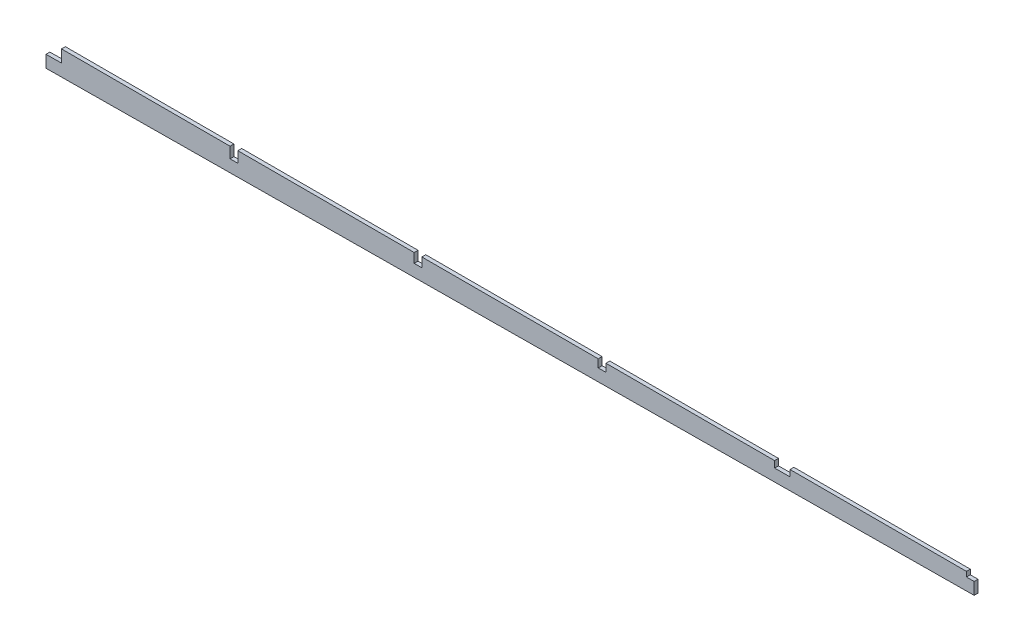
ISO-10303-21;
HEADER;
FILE_DESCRIPTION(('STEP AP214'),'2;1');
FILE_NAME('part.step','',(''),(''),'','','');
FILE_SCHEMA(('AUTOMOTIVE_DESIGN { 1 0 10303 214 1 1 1 1 }'));
ENDSEC;
DATA;
#1=APPLICATION_CONTEXT('core data for automotive mechanical design processes');
#2=APPLICATION_PROTOCOL_DEFINITION('international standard','automotive_design',2000,#1);
#3=PRODUCT_CONTEXT('',#1,'mechanical');
#4=PRODUCT('Part','Part','',(#3));
#5=PRODUCT_RELATED_PRODUCT_CATEGORY('part','',(#4));
#6=PRODUCT_DEFINITION_FORMATION('','',#4);
#7=PRODUCT_DEFINITION_CONTEXT('part definition',#1,'design');
#8=PRODUCT_DEFINITION('design','',#6,#7);
#9=PRODUCT_DEFINITION_SHAPE('','',#8);
#10=(LENGTH_UNIT() NAMED_UNIT(*) SI_UNIT(.MILLI.,.METRE.));
#11=(NAMED_UNIT(*) PLANE_ANGLE_UNIT() SI_UNIT($,.RADIAN.));
#12=(NAMED_UNIT(*) SI_UNIT($,.STERADIAN.) SOLID_ANGLE_UNIT());
#13=UNCERTAINTY_MEASURE_WITH_UNIT(LENGTH_MEASURE(1.E-05),#10,'distance_accuracy_value','');
#14=(GEOMETRIC_REPRESENTATION_CONTEXT(3) GLOBAL_UNCERTAINTY_ASSIGNED_CONTEXT((#13)) GLOBAL_UNIT_ASSIGNED_CONTEXT((#10,
#11,#12)) REPRESENTATION_CONTEXT('',''));
#15=CARTESIAN_POINT('',(0.,0.,0.));
#16=DIRECTION('',(0.,0.,1.));
#17=DIRECTION('',(1.,0.,0.));
#18=AXIS2_PLACEMENT_3D('',#15,#16,#17);
#19=CARTESIAN_POINT('',(0.,0.,1.58749999999434));
#20=DIRECTION('',(0.,0.,-1.));
#21=DIRECTION('',(-1.,0.,0.));
#22=AXIS2_PLACEMENT_3D('',#19,#20,#21);
#23=PLANE('',#22);
#24=DIRECTION('',(1.17623738695303E-12,-1.,0.));
#25=VECTOR('',#24,1.);
#26=CARTESIAN_POINT('',(292.674447160428,-10.8378511882121,1.58749999999438));
#27=LINE('',#26,#25);
#28=CARTESIAN_POINT('',(292.674447160428,-10.8378511882121,1.58749999999438));
#29=VERTEX_POINT('',#28);
#30=CARTESIAN_POINT('',(292.674447160434,-15.793203690976,1.58749999999438));
#31=VERTEX_POINT('',#30);
#32=EDGE_CURVE('E204',#29,#31,#27,.T.);
#33=ORIENTED_EDGE('',*,*,#32,.F.);
#34=DIRECTION('',(0.999966945276623,0.00813070440613762,0.));
#35=VECTOR('',#34,1.);
#36=CARTESIAN_POINT('',(289.499447160417,-10.8636670280372,1.58749999999438));
#37=LINE('',#36,#35);
#38=CARTESIAN_POINT('',(289.499447160417,-10.8636670280372,1.58749999999438));
#39=VERTEX_POINT('',#38);
#40=EDGE_CURVE('E276',#39,#29,#37,.T.);
#41=ORIENTED_EDGE('',*,*,#40,.F.);
#42=DIRECTION('',(0.,1.,0.));
#43=VECTOR('',#42,1.);
#44=CARTESIAN_POINT('',(289.499447160417,-10.8636670280372,1.58749999999438));
#45=LINE('',#44,#43);
#46=CARTESIAN_POINT('',(289.499447160417,-8.83166702803716,1.58749999999438));
#47=VERTEX_POINT('',#46);
#48=EDGE_CURVE('E273',#39,#47,#45,.T.);
#49=ORIENTED_EDGE('',*,*,#48,.T.);
#50=DIRECTION('',(-1.,0.,0.));
#51=VECTOR('',#50,1.);
#52=CARTESIAN_POINT('',(289.499447160417,-8.83166702803716,1.58749999999438));
#53=LINE('',#52,#51);
#54=CARTESIAN_POINT('',(217.109447160158,-8.83166702803716,1.58749999999437));
#55=VERTEX_POINT('',#54);
#56=EDGE_CURVE('E270',#47,#55,#53,.T.);
#57=ORIENTED_EDGE('',*,*,#56,.T.);
#58=DIRECTION('',(0.,1.,0.));
#59=VECTOR('',#58,1.);
#60=CARTESIAN_POINT('',(217.109447160158,-11.4522681760477,1.58749999999437));
#61=LINE('',#60,#59);
#62=CARTESIAN_POINT('',(217.109447160158,-11.4522681760477,1.58749999999437));
#63=VERTEX_POINT('',#62);
#64=EDGE_CURVE('E267',#63,#55,#61,.T.);
#65=ORIENTED_EDGE('',*,*,#64,.F.);
#66=DIRECTION('',(0.999966945276623,0.00813070440613562,0.));
#67=VECTOR('',#66,1.);
#68=CARTESIAN_POINT('',(210.759447160136,-11.5038998556978,1.58749999999437));
#69=LINE('',#68,#67);
#70=CARTESIAN_POINT('',(210.759447160136,-11.5038998556978,1.58749999999437));
#71=VERTEX_POINT('',#70);
#72=EDGE_CURVE('E264',#71,#63,#69,.T.);
#73=ORIENTED_EDGE('',*,*,#72,.F.);
#74=DIRECTION('',(0.,1.,0.));
#75=VECTOR('',#74,1.);
#76=CARTESIAN_POINT('',(210.759447160136,-11.5038998556978,1.58749999999437));
#77=LINE('',#76,#75);
#78=CARTESIAN_POINT('',(210.759447160136,-8.83166702803716,1.58749999999437));
#79=VERTEX_POINT('',#78);
#80=EDGE_CURVE('E261',#71,#79,#77,.T.);
#81=ORIENTED_EDGE('',*,*,#80,.T.);
#82=DIRECTION('',(-1.,0.,0.));
#83=VECTOR('',#82,1.);
#84=CARTESIAN_POINT('',(210.759447160136,-8.83166702803716,1.58749999999437));
#85=LINE('',#84,#83);
#86=CARTESIAN_POINT('',(141.544447159889,-8.83166702803716,1.58749999999436));
#87=VERTEX_POINT('',#86);
#88=EDGE_CURVE('E258',#79,#87,#85,.T.);
#89=ORIENTED_EDGE('',*,*,#88,.T.);
#90=DIRECTION('',(0.,1.,0.));
#91=VECTOR('',#90,1.);
#92=CARTESIAN_POINT('',(141.544447159889,-12.0666851638833,1.58749999999436));
#93=LINE('',#92,#91);
#94=CARTESIAN_POINT('',(141.544447159889,-12.0666851638833,1.58749999999436));
#95=VERTEX_POINT('',#94);
#96=EDGE_CURVE('E255',#95,#87,#93,.T.);
#97=ORIENTED_EDGE('',*,*,#96,.F.);
#98=DIRECTION('',(0.999966945276623,0.00813070440613791,0.));
#99=VECTOR('',#98,1.);
#100=CARTESIAN_POINT('',(138.369447159877,-12.0925010037083,1.58749999999436));
#101=LINE('',#100,#99);
#102=CARTESIAN_POINT('',(138.369447159877,-12.0925010037083,1.58749999999436));
#103=VERTEX_POINT('',#102);
#104=EDGE_CURVE('E252',#103,#95,#101,.T.);
#105=ORIENTED_EDGE('',*,*,#104,.F.);
#106=DIRECTION('',(0.,1.,0.));
#107=VECTOR('',#106,1.);
#108=CARTESIAN_POINT('',(138.369447159877,-12.0925010037083,1.58749999999436));
#109=LINE('',#108,#107);
#110=CARTESIAN_POINT('',(138.369447159877,-8.83166702803716,1.58749999999436));
#111=VERTEX_POINT('',#110);
#112=EDGE_CURVE('E249',#103,#111,#109,.T.);
#113=ORIENTED_EDGE('',*,*,#112,.T.);
#114=DIRECTION('',(-1.,0.,0.));
#115=VECTOR('',#114,1.);
#116=CARTESIAN_POINT('',(138.369447159877,-8.83166702803716,1.58749999999436));
#117=LINE('',#116,#115);
#118=CARTESIAN_POINT('',(65.9794471596188,-8.83166702803716,1.58749999999435));
#119=VERTEX_POINT('',#118);
#120=EDGE_CURVE('E246',#111,#119,#117,.T.);
#121=ORIENTED_EDGE('',*,*,#120,.T.);
#122=DIRECTION('',(0.,1.,0.));
#123=VECTOR('',#122,1.);
#124=CARTESIAN_POINT('',(65.9794471596188,-12.6811021517189,1.58749999999435));
#125=LINE('',#124,#123);
#126=CARTESIAN_POINT('',(65.9794471596188,-12.6811021517189,1.58749999999435));
#127=VERTEX_POINT('',#126);
#128=EDGE_CURVE('E243',#127,#119,#125,.T.);
#129=ORIENTED_EDGE('',*,*,#128,.F.);
#130=DIRECTION('',(0.999966945276623,0.00813070440613784,0.));
#131=VECTOR('',#130,1.);
#132=CARTESIAN_POINT('',(62.8044471596074,-12.7069179915439,1.58749999999435));
#133=LINE('',#132,#131);
#134=CARTESIAN_POINT('',(62.8044471596074,-12.7069179915439,1.58749999999435));
#135=VERTEX_POINT('',#134);
#136=EDGE_CURVE('E240',#135,#127,#133,.T.);
#137=ORIENTED_EDGE('',*,*,#136,.F.);
#138=DIRECTION('',(0.,1.,0.));
#139=VECTOR('',#138,1.);
#140=CARTESIAN_POINT('',(62.8044471596074,-12.7069179915439,1.58749999999435));
#141=LINE('',#140,#139);
#142=CARTESIAN_POINT('',(62.8044471596074,-8.83166702803716,1.58749999999435));
#143=VERTEX_POINT('',#142);
#144=EDGE_CURVE('E237',#135,#143,#141,.T.);
#145=ORIENTED_EDGE('',*,*,#144,.T.);
#146=DIRECTION('',(-1.,0.,0.));
#147=VECTOR('',#146,1.);
#148=CARTESIAN_POINT('',(62.8044471596074,-8.83166702803716,1.58749999999435));
#149=LINE('',#148,#147);
#150=CARTESIAN_POINT('',(-9.58555284065082,-8.83166702803716,1.58749999999434));
#151=VERTEX_POINT('',#150);
#152=EDGE_CURVE('E234',#143,#151,#149,.T.);
#153=ORIENTED_EDGE('',*,*,#152,.T.);
#154=DIRECTION('',(0.,1.,0.));
#155=VECTOR('',#154,1.);
#156=CARTESIAN_POINT('',(-9.58555284065082,-13.2955191395544,1.58749999999434));
#157=LINE('',#156,#155);
#158=CARTESIAN_POINT('',(-9.58555284065082,-13.2955191395544,1.58749999999434));
#159=VERTEX_POINT('',#158);
#160=EDGE_CURVE('E231',#159,#151,#157,.T.);
#161=ORIENTED_EDGE('',*,*,#160,.F.);
#162=DIRECTION('',(0.999966945276622,0.00813070440613889,0.));
#163=VECTOR('',#162,1.);
#164=CARTESIAN_POINT('',(-12.7605528406622,-13.3213349793795,1.58749999999434));
#165=LINE('',#164,#163);
#166=CARTESIAN_POINT('',(-12.7605528406622,-13.3213349793795,1.58749999999434));
#167=VERTEX_POINT('',#166);
#168=EDGE_CURVE('E228',#167,#159,#165,.T.);
#169=ORIENTED_EDGE('',*,*,#168,.F.);
#170=DIRECTION('',(0.,1.,0.));
#171=VECTOR('',#170,1.);
#172=CARTESIAN_POINT('',(-12.7605528406622,-13.3213349793795,1.58749999999434));
#173=LINE('',#172,#171);
#174=CARTESIAN_POINT('',(-12.7605528406622,-8.83166702803716,1.58749999999434));
#175=VERTEX_POINT('',#174);
#176=EDGE_CURVE('E225',#167,#175,#173,.T.);
#177=ORIENTED_EDGE('',*,*,#176,.T.);
#178=DIRECTION('',(-1.,0.,0.));
#179=VECTOR('',#178,1.);
#180=CARTESIAN_POINT('',(-12.7605528406622,-8.83166702803716,1.58749999999434));
#181=LINE('',#180,#179);
#182=CARTESIAN_POINT('',(-81.9755528409093,-8.83166702803716,1.58749999999433));
#183=VERTEX_POINT('',#182);
#184=EDGE_CURVE('E222',#175,#183,#181,.T.);
#185=ORIENTED_EDGE('',*,*,#184,.T.);
#186=DIRECTION('',(0.,1.,0.));
#187=VECTOR('',#186,1.);
#188=CARTESIAN_POINT('',(-81.9755528409093,-13.884120287565,1.58749999999433));
#189=LINE('',#188,#187);
#190=CARTESIAN_POINT('',(-81.9755528409093,-13.884120287565,1.58749999999433));
#191=VERTEX_POINT('',#190);
#192=EDGE_CURVE('E219',#191,#183,#189,.T.);
#193=ORIENTED_EDGE('',*,*,#192,.F.);
#194=DIRECTION('',(0.999966945276623,0.00813070440613791,0.));
#195=VECTOR('',#194,1.);
#196=CARTESIAN_POINT('',(-88.3255528409319,-13.935751967215,1.58749999999433));
#197=LINE('',#196,#195);
#198=CARTESIAN_POINT('',(-88.3255528409319,-13.935751967215,1.58749999999433));
#199=VERTEX_POINT('',#198);
#200=EDGE_CURVE('E216',#199,#191,#197,.T.);
#201=ORIENTED_EDGE('',*,*,#200,.F.);
#202=DIRECTION('',(0.,1.,0.));
#203=VECTOR('',#202,1.);
#204=CARTESIAN_POINT('',(-88.3255528409319,-18.9085485464381,1.58749999999433));
#205=LINE('',#204,#203);
#206=CARTESIAN_POINT('',(-88.3255528409319,-18.9085485464381,1.58749999999433));
#207=VERTEX_POINT('',#206);
#208=EDGE_CURVE('E207',#207,#199,#205,.T.);
#209=ORIENTED_EDGE('',*,*,#208,.F.);
#210=DIRECTION('',(-0.999966571989294,-0.00817648481803085,0.));
#211=VECTOR('',#210,1.);
#212=CARTESIAN_POINT('',(292.674447160434,-15.793203690976,1.58749999999438));
#213=LINE('',#212,#211);
#214=EDGE_CURVE('E196',#31,#207,#213,.T.);
#215=ORIENTED_EDGE('',*,*,#214,.F.);
#216=EDGE_LOOP('',(#33,#41,#49,#57,#65,#73,#81,#89,#97,#105,#113,#121,#129,#137,#145,#153,#161,
#169,#177,#185,#193,#201,#209,#215));
#217=FACE_BOUND('',#216,.T.);
#218=ADVANCED_FACE('F32',(#217),#23,.F.);
#219=CARTESIAN_POINT('',(289.499447160417,-10.8636670280372,-381.133235945354));
#220=DIRECTION('',(0.00813070440613762,-0.999966945276623,0.));
#221=DIRECTION('',(0.999966945276623,0.00813070440613763,0.));
#222=AXIS2_PLACEMENT_3D('',#219,#220,#221);
#223=PLANE('',#222);
#224=DIRECTION('',(0.,0.,1.));
#225=VECTOR('',#224,1.);
#226=CARTESIAN_POINT('',(292.674447160428,-10.8378511882121,-381.133235945354));
#227=LINE('',#226,#225);
#228=CARTESIAN_POINT('',(292.674447160428,-10.8378511882121,0.));
#229=VERTEX_POINT('',#228);
#230=EDGE_CURVE('E210',#229,#29,#227,.T.);
#231=ORIENTED_EDGE('',*,*,#230,.F.);
#232=DIRECTION('',(-0.999966945276623,-0.00813070440613763,0.));
#233=VECTOR('',#232,1.);
#234=CARTESIAN_POINT('',(289.499447160417,-10.8636670280372,0.));
#235=LINE('',#234,#233);
#236=CARTESIAN_POINT('',(289.499447160417,-10.8636670280372,0.));
#237=VERTEX_POINT('',#236);
#238=EDGE_CURVE('E36',#229,#237,#235,.T.);
#239=ORIENTED_EDGE('',*,*,#238,.T.);
#240=DIRECTION('',(0.,0.,1.));
#241=VECTOR('',#240,1.);
#242=CARTESIAN_POINT('',(289.499447160417,-10.8636670280372,-381.133235945354));
#243=LINE('',#242,#241);
#244=EDGE_CURVE('E279',#237,#39,#243,.T.);
#245=ORIENTED_EDGE('',*,*,#244,.T.);
#246=ORIENTED_EDGE('',*,*,#40,.T.);
#247=EDGE_LOOP('',(#231,#239,#245,#246));
#248=FACE_BOUND('',#247,.T.);
#249=ADVANCED_FACE('F378',(#248),#223,.F.);
#250=CARTESIAN_POINT('',(289.499447160417,-10.8636670280372,-381.133235945354));
#251=DIRECTION('',(1.,0.,0.));
#252=DIRECTION('',(0.,0.,-1.));
#253=AXIS2_PLACEMENT_3D('',#250,#251,#252);
#254=PLANE('',#253);
#255=DIRECTION('',(0.,-1.,0.));
#256=VECTOR('',#255,1.);
#257=CARTESIAN_POINT('',(289.499447160417,-10.8636670280372,0.));
#258=LINE('',#257,#256);
#259=CARTESIAN_POINT('',(289.499447160417,-8.83166702803716,0.));
#260=VERTEX_POINT('',#259);
#261=EDGE_CURVE('E373',#260,#237,#258,.T.);
#262=ORIENTED_EDGE('',*,*,#261,.F.);
#263=DIRECTION('',(0.,0.,1.));
#264=VECTOR('',#263,1.);
#265=CARTESIAN_POINT('',(289.499447160417,-8.83166702803716,-381.133235945354));
#266=LINE('',#265,#264);
#267=EDGE_CURVE('E281',#260,#47,#266,.T.);
#268=ORIENTED_EDGE('',*,*,#267,.T.);
#269=ORIENTED_EDGE('',*,*,#48,.F.);
#270=ORIENTED_EDGE('',*,*,#244,.F.);
#271=EDGE_LOOP('',(#262,#268,#269,#270));
#272=FACE_BOUND('',#271,.T.);
#273=ADVANCED_FACE('F390',(#272),#254,.T.);
#274=CARTESIAN_POINT('',(289.499447160417,-8.83166702803716,-381.133235945354));
#275=DIRECTION('',(0.,1.,0.));
#276=DIRECTION('',(0.,0.,1.));
#277=AXIS2_PLACEMENT_3D('',#274,#275,#276);
#278=PLANE('',#277);
#279=DIRECTION('',(1.,0.,0.));
#280=VECTOR('',#279,1.);
#281=CARTESIAN_POINT('',(289.499447160417,-8.83166702803716,0.));
#282=LINE('',#281,#280);
#283=CARTESIAN_POINT('',(217.109447160158,-8.83166702803716,0.));
#284=VERTEX_POINT('',#283);
#285=EDGE_CURVE('E371',#284,#260,#282,.T.);
#286=ORIENTED_EDGE('',*,*,#285,.F.);
#287=DIRECTION('',(0.,0.,1.));
#288=VECTOR('',#287,1.);
#289=CARTESIAN_POINT('',(217.109447160158,-8.83166702803716,-381.133235945354));
#290=LINE('',#289,#288);
#291=EDGE_CURVE('E283',#284,#55,#290,.T.);
#292=ORIENTED_EDGE('',*,*,#291,.T.);
#293=ORIENTED_EDGE('',*,*,#56,.F.);
#294=ORIENTED_EDGE('',*,*,#267,.F.);
#295=EDGE_LOOP('',(#286,#292,#293,#294));
#296=FACE_BOUND('',#295,.T.);
#297=ADVANCED_FACE('F395',(#296),#278,.T.);
#298=CARTESIAN_POINT('',(217.109447160158,-11.4522681760477,-381.133235945354));
#299=DIRECTION('',(1.,0.,0.));
#300=DIRECTION('',(0.,0.,-1.));
#301=AXIS2_PLACEMENT_3D('',#298,#299,#300);
#302=PLANE('',#301);
#303=ORIENTED_EDGE('',*,*,#291,.F.);
#304=DIRECTION('',(0.,-1.,0.));
#305=VECTOR('',#304,1.);
#306=CARTESIAN_POINT('',(217.109447160158,-11.4522681760477,0.));
#307=LINE('',#306,#305);
#308=CARTESIAN_POINT('',(217.109447160158,-11.4522681760477,0.));
#309=VERTEX_POINT('',#308);
#310=EDGE_CURVE('E368',#284,#309,#307,.T.);
#311=ORIENTED_EDGE('',*,*,#310,.T.);
#312=DIRECTION('',(0.,0.,1.));
#313=VECTOR('',#312,1.);
#314=CARTESIAN_POINT('',(217.109447160158,-11.4522681760477,-381.133235945354));
#315=LINE('',#314,#313);
#316=EDGE_CURVE('E285',#309,#63,#315,.T.);
#317=ORIENTED_EDGE('',*,*,#316,.T.);
#318=ORIENTED_EDGE('',*,*,#64,.T.);
#319=EDGE_LOOP('',(#303,#311,#317,#318));
#320=FACE_BOUND('',#319,.T.);
#321=ADVANCED_FACE('F399',(#320),#302,.F.);
#322=CARTESIAN_POINT('',(210.759447160136,-11.5038998556978,-381.133235945354));
#323=DIRECTION('',(0.00813070440613562,-0.999966945276623,0.));
#324=DIRECTION('',(0.999966945276623,0.00813070440613562,0.));
#325=AXIS2_PLACEMENT_3D('',#322,#323,#324);
#326=PLANE('',#325);
#327=ORIENTED_EDGE('',*,*,#316,.F.);
#328=DIRECTION('',(-0.999966945276623,-0.00813070440613562,0.));
#329=VECTOR('',#328,1.);
#330=CARTESIAN_POINT('',(210.759447160136,-11.5038998556978,0.));
#331=LINE('',#330,#329);
#332=CARTESIAN_POINT('',(210.759447160136,-11.5038998556978,0.));
#333=VERTEX_POINT('',#332);
#334=EDGE_CURVE('E365',#309,#333,#331,.T.);
#335=ORIENTED_EDGE('',*,*,#334,.T.);
#336=DIRECTION('',(0.,0.,1.));
#337=VECTOR('',#336,1.);
#338=CARTESIAN_POINT('',(210.759447160136,-11.5038998556978,-381.133235945354));
#339=LINE('',#338,#337);
#340=EDGE_CURVE('E287',#333,#71,#339,.T.);
#341=ORIENTED_EDGE('',*,*,#340,.T.);
#342=ORIENTED_EDGE('',*,*,#72,.T.);
#343=EDGE_LOOP('',(#327,#335,#341,#342));
#344=FACE_BOUND('',#343,.T.);
#345=ADVANCED_FACE('F403',(#344),#326,.F.);
#346=CARTESIAN_POINT('',(210.759447160136,-11.5038998556978,-381.133235945354));
#347=DIRECTION('',(1.,0.,0.));
#348=DIRECTION('',(0.,0.,-1.));
#349=AXIS2_PLACEMENT_3D('',#346,#347,#348);
#350=PLANE('',#349);
#351=DIRECTION('',(0.,-1.,0.));
#352=VECTOR('',#351,1.);
#353=CARTESIAN_POINT('',(210.759447160136,-11.5038998556978,0.));
#354=LINE('',#353,#352);
#355=CARTESIAN_POINT('',(210.759447160136,-8.83166702803716,0.));
#356=VERTEX_POINT('',#355);
#357=EDGE_CURVE('E363',#356,#333,#354,.T.);
#358=ORIENTED_EDGE('',*,*,#357,.F.);
#359=DIRECTION('',(0.,0.,1.));
#360=VECTOR('',#359,1.);
#361=CARTESIAN_POINT('',(210.759447160136,-8.83166702803716,-381.133235945354));
#362=LINE('',#361,#360);
#363=EDGE_CURVE('E289',#356,#79,#362,.T.);
#364=ORIENTED_EDGE('',*,*,#363,.T.);
#365=ORIENTED_EDGE('',*,*,#80,.F.);
#366=ORIENTED_EDGE('',*,*,#340,.F.);
#367=EDGE_LOOP('',(#358,#364,#365,#366));
#368=FACE_BOUND('',#367,.T.);
#369=ADVANCED_FACE('F407',(#368),#350,.T.);
#370=CARTESIAN_POINT('',(210.759447160136,-8.83166702803716,-381.133235945354));
#371=DIRECTION('',(0.,1.,0.));
#372=DIRECTION('',(0.,0.,1.));
#373=AXIS2_PLACEMENT_3D('',#370,#371,#372);
#374=PLANE('',#373);
#375=DIRECTION('',(1.,0.,0.));
#376=VECTOR('',#375,1.);
#377=CARTESIAN_POINT('',(210.759447160136,-8.83166702803716,0.));
#378=LINE('',#377,#376);
#379=CARTESIAN_POINT('',(141.544447159889,-8.83166702803716,0.));
#380=VERTEX_POINT('',#379);
#381=EDGE_CURVE('E361',#380,#356,#378,.T.);
#382=ORIENTED_EDGE('',*,*,#381,.F.);
#383=DIRECTION('',(0.,0.,1.));
#384=VECTOR('',#383,1.);
#385=CARTESIAN_POINT('',(141.544447159889,-8.83166702803716,-381.133235945354));
#386=LINE('',#385,#384);
#387=EDGE_CURVE('E291',#380,#87,#386,.T.);
#388=ORIENTED_EDGE('',*,*,#387,.T.);
#389=ORIENTED_EDGE('',*,*,#88,.F.);
#390=ORIENTED_EDGE('',*,*,#363,.F.);
#391=EDGE_LOOP('',(#382,#388,#389,#390));
#392=FACE_BOUND('',#391,.T.);
#393=ADVANCED_FACE('F411',(#392),#374,.T.);
#394=CARTESIAN_POINT('',(141.544447159889,-12.0666851638833,-381.133235945354));
#395=DIRECTION('',(1.,0.,0.));
#396=DIRECTION('',(0.,0.,-1.));
#397=AXIS2_PLACEMENT_3D('',#394,#395,#396);
#398=PLANE('',#397);
#399=ORIENTED_EDGE('',*,*,#387,.F.);
#400=DIRECTION('',(0.,-1.,0.));
#401=VECTOR('',#400,1.);
#402=CARTESIAN_POINT('',(141.544447159889,-12.0666851638833,0.));
#403=LINE('',#402,#401);
#404=CARTESIAN_POINT('',(141.544447159889,-12.0666851638833,0.));
#405=VERTEX_POINT('',#404);
#406=EDGE_CURVE('E358',#380,#405,#403,.T.);
#407=ORIENTED_EDGE('',*,*,#406,.T.);
#408=DIRECTION('',(0.,0.,1.));
#409=VECTOR('',#408,1.);
#410=CARTESIAN_POINT('',(141.544447159889,-12.0666851638833,-381.133235945354));
#411=LINE('',#410,#409);
#412=EDGE_CURVE('E293',#405,#95,#411,.T.);
#413=ORIENTED_EDGE('',*,*,#412,.T.);
#414=ORIENTED_EDGE('',*,*,#96,.T.);
#415=EDGE_LOOP('',(#399,#407,#413,#414));
#416=FACE_BOUND('',#415,.T.);
#417=ADVANCED_FACE('F415',(#416),#398,.F.);
#418=CARTESIAN_POINT('',(138.369447159877,-12.0925010037083,-381.133235945354));
#419=DIRECTION('',(0.00813070440613791,-0.999966945276623,0.));
#420=DIRECTION('',(0.999966945276623,0.00813070440613791,0.));
#421=AXIS2_PLACEMENT_3D('',#418,#419,#420);
#422=PLANE('',#421);
#423=ORIENTED_EDGE('',*,*,#412,.F.);
#424=DIRECTION('',(-0.999966945276623,-0.00813070440613791,0.));
#425=VECTOR('',#424,1.);
#426=CARTESIAN_POINT('',(138.369447159877,-12.0925010037083,0.));
#427=LINE('',#426,#425);
#428=CARTESIAN_POINT('',(138.369447159877,-12.0925010037083,0.));
#429=VERTEX_POINT('',#428);
#430=EDGE_CURVE('E355',#405,#429,#427,.T.);
#431=ORIENTED_EDGE('',*,*,#430,.T.);
#432=DIRECTION('',(0.,0.,1.));
#433=VECTOR('',#432,1.);
#434=CARTESIAN_POINT('',(138.369447159877,-12.0925010037083,-381.133235945354));
#435=LINE('',#434,#433);
#436=EDGE_CURVE('E295',#429,#103,#435,.T.);
#437=ORIENTED_EDGE('',*,*,#436,.T.);
#438=ORIENTED_EDGE('',*,*,#104,.T.);
#439=EDGE_LOOP('',(#423,#431,#437,#438));
#440=FACE_BOUND('',#439,.T.);
#441=ADVANCED_FACE('F419',(#440),#422,.F.);
#442=CARTESIAN_POINT('',(138.369447159877,-12.0925010037083,-381.133235945354));
#443=DIRECTION('',(1.,0.,0.));
#444=DIRECTION('',(0.,0.,-1.));
#445=AXIS2_PLACEMENT_3D('',#442,#443,#444);
#446=PLANE('',#445);
#447=DIRECTION('',(0.,-1.,0.));
#448=VECTOR('',#447,1.);
#449=CARTESIAN_POINT('',(138.369447159877,-12.0925010037083,0.));
#450=LINE('',#449,#448);
#451=CARTESIAN_POINT('',(138.369447159877,-8.83166702803716,0.));
#452=VERTEX_POINT('',#451);
#453=EDGE_CURVE('E353',#452,#429,#450,.T.);
#454=ORIENTED_EDGE('',*,*,#453,.F.);
#455=DIRECTION('',(0.,0.,1.));
#456=VECTOR('',#455,1.);
#457=CARTESIAN_POINT('',(138.369447159877,-8.83166702803716,-381.133235945354));
#458=LINE('',#457,#456);
#459=EDGE_CURVE('E297',#452,#111,#458,.T.);
#460=ORIENTED_EDGE('',*,*,#459,.T.);
#461=ORIENTED_EDGE('',*,*,#112,.F.);
#462=ORIENTED_EDGE('',*,*,#436,.F.);
#463=EDGE_LOOP('',(#454,#460,#461,#462));
#464=FACE_BOUND('',#463,.T.);
#465=ADVANCED_FACE('F423',(#464),#446,.T.);
#466=CARTESIAN_POINT('',(138.369447159877,-8.83166702803716,-381.133235945354));
#467=DIRECTION('',(0.,1.,0.));
#468=DIRECTION('',(0.,0.,1.));
#469=AXIS2_PLACEMENT_3D('',#466,#467,#468);
#470=PLANE('',#469);
#471=DIRECTION('',(1.,0.,0.));
#472=VECTOR('',#471,1.);
#473=CARTESIAN_POINT('',(138.369447159877,-8.83166702803716,0.));
#474=LINE('',#473,#472);
#475=CARTESIAN_POINT('',(65.9794471596188,-8.83166702803716,0.));
#476=VERTEX_POINT('',#475);
#477=EDGE_CURVE('E351',#476,#452,#474,.T.);
#478=ORIENTED_EDGE('',*,*,#477,.F.);
#479=DIRECTION('',(0.,0.,1.));
#480=VECTOR('',#479,1.);
#481=CARTESIAN_POINT('',(65.9794471596188,-8.83166702803716,-381.133235945354));
#482=LINE('',#481,#480);
#483=EDGE_CURVE('E299',#476,#119,#482,.T.);
#484=ORIENTED_EDGE('',*,*,#483,.T.);
#485=ORIENTED_EDGE('',*,*,#120,.F.);
#486=ORIENTED_EDGE('',*,*,#459,.F.);
#487=EDGE_LOOP('',(#478,#484,#485,#486));
#488=FACE_BOUND('',#487,.T.);
#489=ADVANCED_FACE('F427',(#488),#470,.T.);
#490=CARTESIAN_POINT('',(65.9794471596188,-12.6811021517189,-381.133235945354));
#491=DIRECTION('',(1.,0.,0.));
#492=DIRECTION('',(0.,0.,-1.));
#493=AXIS2_PLACEMENT_3D('',#490,#491,#492);
#494=PLANE('',#493);
#495=ORIENTED_EDGE('',*,*,#483,.F.);
#496=DIRECTION('',(0.,-1.,0.));
#497=VECTOR('',#496,1.);
#498=CARTESIAN_POINT('',(65.9794471596188,-12.6811021517189,0.));
#499=LINE('',#498,#497);
#500=CARTESIAN_POINT('',(65.9794471596188,-12.6811021517189,0.));
#501=VERTEX_POINT('',#500);
#502=EDGE_CURVE('E348',#476,#501,#499,.T.);
#503=ORIENTED_EDGE('',*,*,#502,.T.);
#504=DIRECTION('',(0.,0.,1.));
#505=VECTOR('',#504,1.);
#506=CARTESIAN_POINT('',(65.9794471596188,-12.6811021517189,-381.133235945354));
#507=LINE('',#506,#505);
#508=EDGE_CURVE('E301',#501,#127,#507,.T.);
#509=ORIENTED_EDGE('',*,*,#508,.T.);
#510=ORIENTED_EDGE('',*,*,#128,.T.);
#511=EDGE_LOOP('',(#495,#503,#509,#510));
#512=FACE_BOUND('',#511,.T.);
#513=ADVANCED_FACE('F431',(#512),#494,.F.);
#514=CARTESIAN_POINT('',(62.8044471596075,-12.7069179915439,-381.133235945354));
#515=DIRECTION('',(0.00813070440613784,-0.999966945276623,0.));
#516=DIRECTION('',(0.999966945276623,0.00813070440613784,0.));
#517=AXIS2_PLACEMENT_3D('',#514,#515,#516);
#518=PLANE('',#517);
#519=ORIENTED_EDGE('',*,*,#508,.F.);
#520=DIRECTION('',(-0.999966945276623,-0.00813070440613784,0.));
#521=VECTOR('',#520,1.);
#522=CARTESIAN_POINT('',(62.8044471596075,-12.7069179915439,0.));
#523=LINE('',#522,#521);
#524=CARTESIAN_POINT('',(62.8044471596074,-12.7069179915439,0.));
#525=VERTEX_POINT('',#524);
#526=EDGE_CURVE('E345',#501,#525,#523,.T.);
#527=ORIENTED_EDGE('',*,*,#526,.T.);
#528=DIRECTION('',(0.,0.,1.));
#529=VECTOR('',#528,1.);
#530=CARTESIAN_POINT('',(62.8044471596075,-12.7069179915439,-381.133235945354));
#531=LINE('',#530,#529);
#532=EDGE_CURVE('E303',#525,#135,#531,.T.);
#533=ORIENTED_EDGE('',*,*,#532,.T.);
#534=ORIENTED_EDGE('',*,*,#136,.T.);
#535=EDGE_LOOP('',(#519,#527,#533,#534));
#536=FACE_BOUND('',#535,.T.);
#537=ADVANCED_FACE('F435',(#536),#518,.F.);
#538=CARTESIAN_POINT('',(62.8044471596075,-12.7069179915439,-381.133235945354));
#539=DIRECTION('',(1.,0.,0.));
#540=DIRECTION('',(0.,0.,-1.));
#541=AXIS2_PLACEMENT_3D('',#538,#539,#540);
#542=PLANE('',#541);
#543=DIRECTION('',(0.,-1.,0.));
#544=VECTOR('',#543,1.);
#545=CARTESIAN_POINT('',(62.8044471596074,-12.7069179915439,0.));
#546=LINE('',#545,#544);
#547=CARTESIAN_POINT('',(62.8044471596074,-8.83166702803716,0.));
#548=VERTEX_POINT('',#547);
#549=EDGE_CURVE('E343',#548,#525,#546,.T.);
#550=ORIENTED_EDGE('',*,*,#549,.F.);
#551=DIRECTION('',(0.,0.,1.));
#552=VECTOR('',#551,1.);
#553=CARTESIAN_POINT('',(62.8044471596075,-8.83166702803716,-381.133235945354));
#554=LINE('',#553,#552);
#555=EDGE_CURVE('E305',#548,#143,#554,.T.);
#556=ORIENTED_EDGE('',*,*,#555,.T.);
#557=ORIENTED_EDGE('',*,*,#144,.F.);
#558=ORIENTED_EDGE('',*,*,#532,.F.);
#559=EDGE_LOOP('',(#550,#556,#557,#558));
#560=FACE_BOUND('',#559,.T.);
#561=ADVANCED_FACE('F439',(#560),#542,.T.);
#562=CARTESIAN_POINT('',(62.8044471596075,-8.83166702803716,-381.133235945354));
#563=DIRECTION('',(0.,1.,0.));
#564=DIRECTION('',(0.,0.,1.));
#565=AXIS2_PLACEMENT_3D('',#562,#563,#564);
#566=PLANE('',#565);
#567=DIRECTION('',(1.,0.,0.));
#568=VECTOR('',#567,1.);
#569=CARTESIAN_POINT('',(62.8044471596075,-8.83166702803716,0.));
#570=LINE('',#569,#568);
#571=CARTESIAN_POINT('',(-9.58555284065082,-8.83166702803716,0.));
#572=VERTEX_POINT('',#571);
#573=EDGE_CURVE('E341',#572,#548,#570,.T.);
#574=ORIENTED_EDGE('',*,*,#573,.F.);
#575=DIRECTION('',(0.,0.,1.));
#576=VECTOR('',#575,1.);
#577=CARTESIAN_POINT('',(-9.58555284065076,-8.83166702803716,-381.133235945354));
#578=LINE('',#577,#576);
#579=EDGE_CURVE('E307',#572,#151,#578,.T.);
#580=ORIENTED_EDGE('',*,*,#579,.T.);
#581=ORIENTED_EDGE('',*,*,#152,.F.);
#582=ORIENTED_EDGE('',*,*,#555,.F.);
#583=EDGE_LOOP('',(#574,#580,#581,#582));
#584=FACE_BOUND('',#583,.T.);
#585=ADVANCED_FACE('F443',(#584),#566,.T.);
#586=CARTESIAN_POINT('',(-9.58555284065076,-13.2955191395544,-381.133235945354));
#587=DIRECTION('',(1.,0.,0.));
#588=DIRECTION('',(0.,1.,0.));
#589=AXIS2_PLACEMENT_3D('',#586,#587,#588);
#590=PLANE('',#589);
#591=ORIENTED_EDGE('',*,*,#579,.F.);
#592=DIRECTION('',(0.,-1.,0.));
#593=VECTOR('',#592,1.);
#594=CARTESIAN_POINT('',(-9.58555284065082,-13.2955191395544,0.));
#595=LINE('',#594,#593);
#596=CARTESIAN_POINT('',(-9.58555284065082,-13.2955191395544,0.));
#597=VERTEX_POINT('',#596);
#598=EDGE_CURVE('E338',#572,#597,#595,.T.);
#599=ORIENTED_EDGE('',*,*,#598,.T.);
#600=DIRECTION('',(0.,0.,1.));
#601=VECTOR('',#600,1.);
#602=CARTESIAN_POINT('',(-9.58555284065076,-13.2955191395544,-381.133235945354));
#603=LINE('',#602,#601);
#604=EDGE_CURVE('E309',#597,#159,#603,.T.);
#605=ORIENTED_EDGE('',*,*,#604,.T.);
#606=ORIENTED_EDGE('',*,*,#160,.T.);
#607=EDGE_LOOP('',(#591,#599,#605,#606));
#608=FACE_BOUND('',#607,.T.);
#609=ADVANCED_FACE('F447',(#608),#590,.F.);
#610=CARTESIAN_POINT('',(-12.7605528406621,-13.3213349793795,-381.133235945354));
#611=DIRECTION('',(0.00813070440613889,-0.999966945276623,0.));
#612=DIRECTION('',(0.999966945276623,0.00813070440613889,0.));
#613=AXIS2_PLACEMENT_3D('',#610,#611,#612);
#614=PLANE('',#613);
#615=ORIENTED_EDGE('',*,*,#604,.F.);
#616=DIRECTION('',(-0.999966945276623,-0.00813070440613889,0.));
#617=VECTOR('',#616,1.);
#618=CARTESIAN_POINT('',(-12.7605528406621,-13.3213349793795,0.));
#619=LINE('',#618,#617);
#620=CARTESIAN_POINT('',(-12.7605528406622,-13.3213349793795,0.));
#621=VERTEX_POINT('',#620);
#622=EDGE_CURVE('E335',#597,#621,#619,.T.);
#623=ORIENTED_EDGE('',*,*,#622,.T.);
#624=DIRECTION('',(0.,0.,1.));
#625=VECTOR('',#624,1.);
#626=CARTESIAN_POINT('',(-12.7605528406621,-13.3213349793795,-381.133235945354));
#627=LINE('',#626,#625);
#628=EDGE_CURVE('E311',#621,#167,#627,.T.);
#629=ORIENTED_EDGE('',*,*,#628,.T.);
#630=ORIENTED_EDGE('',*,*,#168,.T.);
#631=EDGE_LOOP('',(#615,#623,#629,#630));
#632=FACE_BOUND('',#631,.T.);
#633=ADVANCED_FACE('F451',(#632),#614,.F.);
#634=CARTESIAN_POINT('',(-12.7605528406621,-13.3213349793795,-381.133235945354));
#635=DIRECTION('',(1.,0.,0.));
#636=DIRECTION('',(0.,1.,0.));
#637=AXIS2_PLACEMENT_3D('',#634,#635,#636);
#638=PLANE('',#637);
#639=DIRECTION('',(0.,-1.,0.));
#640=VECTOR('',#639,1.);
#641=CARTESIAN_POINT('',(-12.7605528406622,-13.3213349793795,0.));
#642=LINE('',#641,#640);
#643=CARTESIAN_POINT('',(-12.7605528406622,-8.83166702803716,0.));
#644=VERTEX_POINT('',#643);
#645=EDGE_CURVE('E333',#644,#621,#642,.T.);
#646=ORIENTED_EDGE('',*,*,#645,.F.);
#647=DIRECTION('',(0.,0.,1.));
#648=VECTOR('',#647,1.);
#649=CARTESIAN_POINT('',(-12.7605528406621,-8.83166702803716,-381.133235945354));
#650=LINE('',#649,#648);
#651=EDGE_CURVE('E313',#644,#175,#650,.T.);
#652=ORIENTED_EDGE('',*,*,#651,.T.);
#653=ORIENTED_EDGE('',*,*,#176,.F.);
#654=ORIENTED_EDGE('',*,*,#628,.F.);
#655=EDGE_LOOP('',(#646,#652,#653,#654));
#656=FACE_BOUND('',#655,.T.);
#657=ADVANCED_FACE('F455',(#656),#638,.T.);
#658=CARTESIAN_POINT('',(-12.7605528406621,-8.83166702803716,-381.133235945354));
#659=DIRECTION('',(0.,1.,0.));
#660=DIRECTION('',(0.,0.,1.));
#661=AXIS2_PLACEMENT_3D('',#658,#659,#660);
#662=PLANE('',#661);
#663=DIRECTION('',(1.,0.,0.));
#664=VECTOR('',#663,1.);
#665=CARTESIAN_POINT('',(-12.7605528406621,-8.83166702803716,0.));
#666=LINE('',#665,#664);
#667=CARTESIAN_POINT('',(-81.9755528409093,-8.83166702803716,0.));
#668=VERTEX_POINT('',#667);
#669=EDGE_CURVE('E331',#668,#644,#666,.T.);
#670=ORIENTED_EDGE('',*,*,#669,.F.);
#671=DIRECTION('',(0.,0.,1.));
#672=VECTOR('',#671,1.);
#673=CARTESIAN_POINT('',(-81.9755528409092,-8.83166702803716,-381.133235945354));
#674=LINE('',#673,#672);
#675=EDGE_CURVE('E315',#668,#183,#674,.T.);
#676=ORIENTED_EDGE('',*,*,#675,.T.);
#677=ORIENTED_EDGE('',*,*,#184,.F.);
#678=ORIENTED_EDGE('',*,*,#651,.F.);
#679=EDGE_LOOP('',(#670,#676,#677,#678));
#680=FACE_BOUND('',#679,.T.);
#681=ADVANCED_FACE('F459',(#680),#662,.T.);
#682=CARTESIAN_POINT('',(-81.9755528409092,-13.884120287565,-381.133235945354));
#683=DIRECTION('',(1.,0.,0.));
#684=DIRECTION('',(0.,0.,-1.));
#685=AXIS2_PLACEMENT_3D('',#682,#683,#684);
#686=PLANE('',#685);
#687=ORIENTED_EDGE('',*,*,#675,.F.);
#688=DIRECTION('',(0.,-1.,0.));
#689=VECTOR('',#688,1.);
#690=CARTESIAN_POINT('',(-81.9755528409093,-13.884120287565,0.));
#691=LINE('',#690,#689);
#692=CARTESIAN_POINT('',(-81.9755528409093,-13.884120287565,0.));
#693=VERTEX_POINT('',#692);
#694=EDGE_CURVE('E326',#668,#693,#691,.T.);
#695=ORIENTED_EDGE('',*,*,#694,.T.);
#696=DIRECTION('',(0.,0.,1.));
#697=VECTOR('',#696,1.);
#698=CARTESIAN_POINT('',(-81.9755528409092,-13.884120287565,-381.133235945354));
#699=LINE('',#698,#697);
#700=EDGE_CURVE('E317',#693,#191,#699,.T.);
#701=ORIENTED_EDGE('',*,*,#700,.T.);
#702=ORIENTED_EDGE('',*,*,#192,.T.);
#703=EDGE_LOOP('',(#687,#695,#701,#702));
#704=FACE_BOUND('',#703,.T.);
#705=ADVANCED_FACE('F463',(#704),#686,.F.);
#706=CARTESIAN_POINT('',(-88.3255528409318,-13.935751967215,-381.133235945354));
#707=DIRECTION('',(0.00813070440613791,-0.999966945276623,0.));
#708=DIRECTION('',(0.999966945276623,0.00813070440613791,0.));
#709=AXIS2_PLACEMENT_3D('',#706,#707,#708);
#710=PLANE('',#709);
#711=ORIENTED_EDGE('',*,*,#700,.F.);
#712=DIRECTION('',(-0.999966945276623,-0.00813070440613791,0.));
#713=VECTOR('',#712,1.);
#714=CARTESIAN_POINT('',(-88.3255528409318,-13.935751967215,0.));
#715=LINE('',#714,#713);
#716=CARTESIAN_POINT('',(-88.3255528409319,-13.935751967215,0.));
#717=VERTEX_POINT('',#716);
#718=EDGE_CURVE('E324',#693,#717,#715,.T.);
#719=ORIENTED_EDGE('',*,*,#718,.T.);
#720=DIRECTION('',(0.,0.,1.));
#721=VECTOR('',#720,1.);
#722=CARTESIAN_POINT('',(-88.3255528409318,-13.935751967215,-381.133235945354));
#723=LINE('',#722,#721);
#724=EDGE_CURVE('E319',#717,#199,#723,.T.);
#725=ORIENTED_EDGE('',*,*,#724,.T.);
#726=ORIENTED_EDGE('',*,*,#200,.T.);
#727=EDGE_LOOP('',(#711,#719,#725,#726));
#728=FACE_BOUND('',#727,.T.);
#729=ADVANCED_FACE('F467',(#728),#710,.F.);
#730=CARTESIAN_POINT('',(-88.3255528409318,-18.9085485464381,-381.133235945354));
#731=DIRECTION('',(1.,0.,0.));
#732=DIRECTION('',(0.,0.,-1.));
#733=AXIS2_PLACEMENT_3D('',#730,#731,#732);
#734=PLANE('',#733);
#735=ORIENTED_EDGE('',*,*,#724,.F.);
#736=DIRECTION('',(0.,-1.,0.));
#737=VECTOR('',#736,1.);
#738=CARTESIAN_POINT('',(-88.3255528409319,-18.9085485464381,0.));
#739=LINE('',#738,#737);
#740=CARTESIAN_POINT('',(-88.3255528409319,-18.9085485464381,0.));
#741=VERTEX_POINT('',#740);
#742=EDGE_CURVE('E53',#717,#741,#739,.T.);
#743=ORIENTED_EDGE('',*,*,#742,.T.);
#744=DIRECTION('',(0.,0.,1.));
#745=VECTOR('',#744,1.);
#746=CARTESIAN_POINT('',(-88.3255528409318,-18.9085485464381,-381.133235945354));
#747=LINE('',#746,#745);
#748=EDGE_CURVE('E200',#741,#207,#747,.T.);
#749=ORIENTED_EDGE('',*,*,#748,.T.);
#750=ORIENTED_EDGE('',*,*,#208,.T.);
#751=EDGE_LOOP('',(#735,#743,#749,#750));
#752=FACE_BOUND('',#751,.T.);
#753=ADVANCED_FACE('F322',(#752),#734,.F.);
#754=CARTESIAN_POINT('',(292.674447160434,-15.793203690976,-381.133235945354));
#755=DIRECTION('',(-0.00817648481803085,0.999966571989294,0.));
#756=DIRECTION('',(-0.999966571989294,-0.00817648481803085,0.));
#757=AXIS2_PLACEMENT_3D('',#754,#755,#756);
#758=PLANE('',#757);
#759=ORIENTED_EDGE('',*,*,#748,.F.);
#760=DIRECTION('',(0.999966571989294,0.00817648481803085,0.));
#761=VECTOR('',#760,1.);
#762=CARTESIAN_POINT('',(292.674447160434,-15.793203690976,0.));
#763=LINE('',#762,#761);
#764=CARTESIAN_POINT('',(292.674447160434,-15.793203690976,0.));
#765=VERTEX_POINT('',#764);
#766=EDGE_CURVE('E41',#741,#765,#763,.T.);
#767=ORIENTED_EDGE('',*,*,#766,.T.);
#768=DIRECTION('',(0.,0.,1.));
#769=VECTOR('',#768,1.);
#770=CARTESIAN_POINT('',(292.674447160434,-15.793203690976,-381.133235945354));
#771=LINE('',#770,#769);
#772=EDGE_CURVE('E193',#765,#31,#771,.T.);
#773=ORIENTED_EDGE('',*,*,#772,.T.);
#774=ORIENTED_EDGE('',*,*,#214,.T.);
#775=EDGE_LOOP('',(#759,#767,#773,#774));
#776=FACE_BOUND('',#775,.T.);
#777=ADVANCED_FACE('F195',(#776),#758,.F.);
#778=CARTESIAN_POINT('',(292.674447160428,-10.8378511882121,-381.133235945354));
#779=DIRECTION('',(-1.,-1.17623738695303E-12,0.));
#780=DIRECTION('',(1.17623738695303E-12,-1.,0.));
#781=AXIS2_PLACEMENT_3D('',#778,#779,#780);
#782=PLANE('',#781);
#783=ORIENTED_EDGE('',*,*,#772,.F.);
#784=DIRECTION('',(-1.17623738695303E-12,1.,0.));
#785=VECTOR('',#784,1.);
#786=CARTESIAN_POINT('',(292.674447160428,-10.8378511882121,0.));
#787=LINE('',#786,#785);
#788=EDGE_CURVE('E11',#765,#229,#787,.T.);
#789=ORIENTED_EDGE('',*,*,#788,.T.);
#790=ORIENTED_EDGE('',*,*,#230,.T.);
#791=ORIENTED_EDGE('',*,*,#32,.T.);
#792=EDGE_LOOP('',(#783,#789,#790,#791));
#793=FACE_BOUND('',#792,.T.);
#794=ADVANCED_FACE('F34',(#793),#782,.F.);
#795=CARTESIAN_POINT('',(-62.9260370916752,-7.25098371628456,0.));
#796=DIRECTION('',(0.,0.,1.));
#797=DIRECTION('',(1.,0.,0.));
#798=AXIS2_PLACEMENT_3D('',#795,#796,#797);
#799=PLANE('',#798);
#800=ORIENTED_EDGE('',*,*,#766,.F.);
#801=ORIENTED_EDGE('',*,*,#742,.F.);
#802=ORIENTED_EDGE('',*,*,#718,.F.);
#803=ORIENTED_EDGE('',*,*,#694,.F.);
#804=ORIENTED_EDGE('',*,*,#669,.T.);
#805=ORIENTED_EDGE('',*,*,#645,.T.);
#806=ORIENTED_EDGE('',*,*,#622,.F.);
#807=ORIENTED_EDGE('',*,*,#598,.F.);
#808=ORIENTED_EDGE('',*,*,#573,.T.);
#809=ORIENTED_EDGE('',*,*,#549,.T.);
#810=ORIENTED_EDGE('',*,*,#526,.F.);
#811=ORIENTED_EDGE('',*,*,#502,.F.);
#812=ORIENTED_EDGE('',*,*,#477,.T.);
#813=ORIENTED_EDGE('',*,*,#453,.T.);
#814=ORIENTED_EDGE('',*,*,#430,.F.);
#815=ORIENTED_EDGE('',*,*,#406,.F.);
#816=ORIENTED_EDGE('',*,*,#381,.T.);
#817=ORIENTED_EDGE('',*,*,#357,.T.);
#818=ORIENTED_EDGE('',*,*,#334,.F.);
#819=ORIENTED_EDGE('',*,*,#310,.F.);
#820=ORIENTED_EDGE('',*,*,#285,.T.);
#821=ORIENTED_EDGE('',*,*,#261,.T.);
#822=ORIENTED_EDGE('',*,*,#238,.F.);
#823=ORIENTED_EDGE('',*,*,#788,.F.);
#824=EDGE_LOOP('',(#800,#801,#802,#803,#804,#805,#806,#807,#808,#809,#810,#811,#812,#813,#814,
#815,#816,#817,#818,#819,#820,#821,#822,#823));
#825=FACE_BOUND('',#824,.T.);
#826=ADVANCED_FACE('F379',(#825),#799,.F.);
#827=CLOSED_SHELL('',(#218,#249,#273,#297,#321,#345,#369,#393,#417,#441,#465,#489,#513,#537,
#561,#585,#609,#633,#657,#681,#705,#729,#753,#777,#794,#826));
#828=MANIFOLD_SOLID_BREP('B2',#827);
#829=ADVANCED_BREP_SHAPE_REPRESENTATION('',(#18,#828),#14);
#830=SHAPE_DEFINITION_REPRESENTATION(#9,#829);
ENDSEC;
END-ISO-10303-21;
